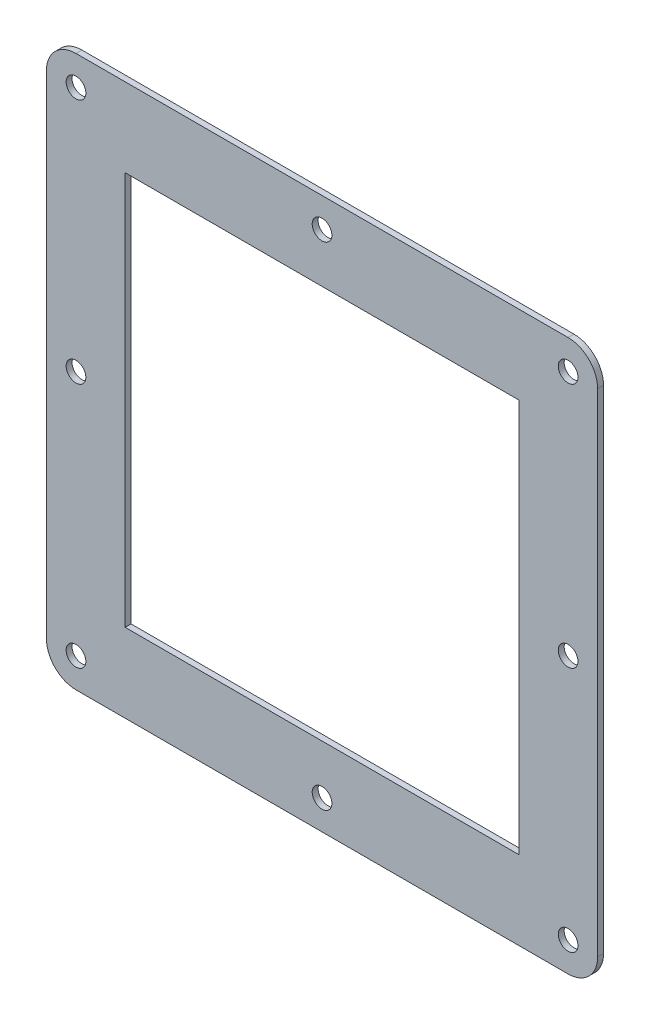
ISO-10303-21;
HEADER;
FILE_DESCRIPTION(('STEP AP214'),'2;1');
FILE_NAME('part.step','',(''),(''),'','','');
FILE_SCHEMA(('AUTOMOTIVE_DESIGN { 1 0 10303 214 1 1 1 1 }'));
ENDSEC;
DATA;
#1=APPLICATION_CONTEXT('core data for automotive mechanical design processes');
#2=APPLICATION_PROTOCOL_DEFINITION('international standard','automotive_design',2000,#1);
#3=PRODUCT_CONTEXT('',#1,'mechanical');
#4=PRODUCT('Part','Part','',(#3));
#5=PRODUCT_RELATED_PRODUCT_CATEGORY('part','',(#4));
#6=PRODUCT_DEFINITION_FORMATION('','',#4);
#7=PRODUCT_DEFINITION_CONTEXT('part definition',#1,'design');
#8=PRODUCT_DEFINITION('design','',#6,#7);
#9=PRODUCT_DEFINITION_SHAPE('','',#8);
#10=(LENGTH_UNIT() NAMED_UNIT(*) SI_UNIT(.MILLI.,.METRE.));
#11=(NAMED_UNIT(*) PLANE_ANGLE_UNIT() SI_UNIT($,.RADIAN.));
#12=(NAMED_UNIT(*) SI_UNIT($,.STERADIAN.) SOLID_ANGLE_UNIT());
#13=UNCERTAINTY_MEASURE_WITH_UNIT(LENGTH_MEASURE(1.E-05),#10,'distance_accuracy_value','');
#14=(GEOMETRIC_REPRESENTATION_CONTEXT(3) GLOBAL_UNCERTAINTY_ASSIGNED_CONTEXT((#13)) GLOBAL_UNIT_ASSIGNED_CONTEXT((#10,
#11,#12)) REPRESENTATION_CONTEXT('',''));
#15=CARTESIAN_POINT('',(0.,0.,0.));
#16=DIRECTION('',(0.,0.,1.));
#17=DIRECTION('',(1.,0.,0.));
#18=AXIS2_PLACEMENT_3D('',#15,#16,#17);
#19=CARTESIAN_POINT('',(-125.,-125.,3.));
#20=DIRECTION('',(0.,0.,1.));
#21=DIRECTION('',(1.,0.,0.));
#22=AXIS2_PLACEMENT_3D('',#19,#20,#21);
#23=PLANE('',#22);
#24=DIRECTION('',(0.,1.,0.));
#25=VECTOR('',#24,1.);
#26=CARTESIAN_POINT('',(100.,100.,3.));
#27=LINE('',#26,#25);
#28=CARTESIAN_POINT('',(100.,-100.,3.));
#29=VERTEX_POINT('',#28);
#30=CARTESIAN_POINT('',(100.,100.,3.));
#31=VERTEX_POINT('',#30);
#32=EDGE_CURVE('E48',#29,#31,#27,.T.);
#33=ORIENTED_EDGE('',*,*,#32,.F.);
#34=DIRECTION('',(1.,0.,0.));
#35=VECTOR('',#34,1.);
#36=CARTESIAN_POINT('',(-100.,-100.,3.));
#37=LINE('',#36,#35);
#38=CARTESIAN_POINT('',(-100.,-100.,3.));
#39=VERTEX_POINT('',#38);
#40=EDGE_CURVE('E140',#39,#29,#37,.T.);
#41=ORIENTED_EDGE('',*,*,#40,.F.);
#42=DIRECTION('',(0.,-1.,0.));
#43=VECTOR('',#42,1.);
#44=CARTESIAN_POINT('',(-100.,100.,3.));
#45=LINE('',#44,#43);
#46=CARTESIAN_POINT('',(-100.,100.,3.));
#47=VERTEX_POINT('',#46);
#48=EDGE_CURVE('E125',#47,#39,#45,.T.);
#49=ORIENTED_EDGE('',*,*,#48,.F.);
#50=DIRECTION('',(-1.,0.,0.));
#51=VECTOR('',#50,1.);
#52=CARTESIAN_POINT('',(-100.,100.,3.));
#53=LINE('',#52,#51);
#54=EDGE_CURVE('E134',#31,#47,#53,.T.);
#55=ORIENTED_EDGE('',*,*,#54,.F.);
#56=EDGE_LOOP('',(#33,#41,#49,#55));
#57=FACE_BOUND('',#56,.T.);
#58=CARTESIAN_POINT('',(0.,-125.,3.));
#59=DIRECTION('',(0.,0.,1.));
#60=DIRECTION('',(1.,0.,0.));
#61=AXIS2_PLACEMENT_3D('',#58,#59,#60);
#62=CIRCLE('',#61,5.);
#63=CARTESIAN_POINT('',(5.,-125.,3.));
#64=VERTEX_POINT('',#63);
#65=EDGE_CURVE('E156',#64,#64,#62,.T.);
#66=ORIENTED_EDGE('',*,*,#65,.F.);
#67=EDGE_LOOP('',(#66));
#68=FACE_BOUND('',#67,.T.);
#69=CARTESIAN_POINT('',(125.,0.,3.));
#70=DIRECTION('',(0.,0.,1.));
#71=DIRECTION('',(1.,0.,0.));
#72=AXIS2_PLACEMENT_3D('',#69,#70,#71);
#73=CIRCLE('',#72,5.00000000000001);
#74=CARTESIAN_POINT('',(130.,0.,3.));
#75=VERTEX_POINT('',#74);
#76=EDGE_CURVE('E174',#75,#75,#73,.T.);
#77=ORIENTED_EDGE('',*,*,#76,.F.);
#78=EDGE_LOOP('',(#77));
#79=FACE_BOUND('',#78,.T.);
#80=CARTESIAN_POINT('',(0.,125.,3.));
#81=DIRECTION('',(0.,0.,1.));
#82=DIRECTION('',(1.,0.,0.));
#83=AXIS2_PLACEMENT_3D('',#80,#81,#82);
#84=CIRCLE('',#83,5.);
#85=CARTESIAN_POINT('',(4.99999999999999,125.,3.));
#86=VERTEX_POINT('',#85);
#87=EDGE_CURVE('E186',#86,#86,#84,.T.);
#88=ORIENTED_EDGE('',*,*,#87,.F.);
#89=EDGE_LOOP('',(#88));
#90=FACE_BOUND('',#89,.T.);
#91=CARTESIAN_POINT('',(-125.,-125.,3.));
#92=DIRECTION('',(0.,0.,1.));
#93=DIRECTION('',(1.,0.,0.));
#94=AXIS2_PLACEMENT_3D('',#91,#92,#93);
#95=CIRCLE('',#94,15.);
#96=CARTESIAN_POINT('',(-140.,-125.,3.));
#97=VERTEX_POINT('',#96);
#98=CARTESIAN_POINT('',(-125.,-140.,3.));
#99=VERTEX_POINT('',#98);
#100=EDGE_CURVE('E198',#97,#99,#95,.T.);
#101=ORIENTED_EDGE('',*,*,#100,.T.);
#102=DIRECTION('',(1.,0.,0.));
#103=VECTOR('',#102,1.);
#104=CARTESIAN_POINT('',(-125.,-140.,3.));
#105=LINE('',#104,#103);
#106=CARTESIAN_POINT('',(125.,-140.,3.));
#107=VERTEX_POINT('',#106);
#108=EDGE_CURVE('E201',#99,#107,#105,.T.);
#109=ORIENTED_EDGE('',*,*,#108,.T.);
#110=CARTESIAN_POINT('',(125.,-125.,3.));
#111=DIRECTION('',(0.,0.,1.));
#112=DIRECTION('',(1.,0.,0.));
#113=AXIS2_PLACEMENT_3D('',#110,#111,#112);
#114=CIRCLE('',#113,15.);
#115=CARTESIAN_POINT('',(140.,-125.,3.));
#116=VERTEX_POINT('',#115);
#117=EDGE_CURVE('E204',#107,#116,#114,.T.);
#118=ORIENTED_EDGE('',*,*,#117,.T.);
#119=DIRECTION('',(0.,1.,0.));
#120=VECTOR('',#119,1.);
#121=CARTESIAN_POINT('',(140.,125.,3.));
#122=LINE('',#121,#120);
#123=CARTESIAN_POINT('',(140.,125.,3.));
#124=VERTEX_POINT('',#123);
#125=EDGE_CURVE('E206',#116,#124,#122,.T.);
#126=ORIENTED_EDGE('',*,*,#125,.T.);
#127=CARTESIAN_POINT('',(125.,125.,3.));
#128=DIRECTION('',(0.,0.,1.));
#129=DIRECTION('',(-1.,0.,0.));
#130=AXIS2_PLACEMENT_3D('',#127,#128,#129);
#131=CIRCLE('',#130,15.);
#132=CARTESIAN_POINT('',(125.,140.,3.));
#133=VERTEX_POINT('',#132);
#134=EDGE_CURVE('E208',#124,#133,#131,.T.);
#135=ORIENTED_EDGE('',*,*,#134,.T.);
#136=DIRECTION('',(-1.,0.,0.));
#137=VECTOR('',#136,1.);
#138=CARTESIAN_POINT('',(-125.,140.,3.));
#139=LINE('',#138,#137);
#140=CARTESIAN_POINT('',(-125.,140.,3.));
#141=VERTEX_POINT('',#140);
#142=EDGE_CURVE('E210',#133,#141,#139,.T.);
#143=ORIENTED_EDGE('',*,*,#142,.T.);
#144=CARTESIAN_POINT('',(-125.,125.,3.));
#145=DIRECTION('',(0.,0.,1.));
#146=DIRECTION('',(1.,0.,0.));
#147=AXIS2_PLACEMENT_3D('',#144,#145,#146);
#148=CIRCLE('',#147,15.);
#149=CARTESIAN_POINT('',(-140.,125.,3.));
#150=VERTEX_POINT('',#149);
#151=EDGE_CURVE('E212',#141,#150,#148,.T.);
#152=ORIENTED_EDGE('',*,*,#151,.T.);
#153=DIRECTION('',(0.,-1.,0.));
#154=VECTOR('',#153,1.);
#155=CARTESIAN_POINT('',(-140.,125.,3.));
#156=LINE('',#155,#154);
#157=EDGE_CURVE('E214',#150,#97,#156,.T.);
#158=ORIENTED_EDGE('',*,*,#157,.T.);
#159=EDGE_LOOP('',(#101,#109,#118,#126,#135,#143,#152,#158));
#160=FACE_BOUND('',#159,.T.);
#161=CARTESIAN_POINT('',(-125.,125.,3.));
#162=DIRECTION('',(0.,0.,1.));
#163=DIRECTION('',(1.,0.,0.));
#164=AXIS2_PLACEMENT_3D('',#161,#162,#163);
#165=CIRCLE('',#164,5.00000000000001);
#166=CARTESIAN_POINT('',(-120.,125.,3.));
#167=VERTEX_POINT('',#166);
#168=EDGE_CURVE('E192',#167,#167,#165,.T.);
#169=ORIENTED_EDGE('',*,*,#168,.F.);
#170=EDGE_LOOP('',(#169));
#171=FACE_BOUND('',#170,.T.);
#172=CARTESIAN_POINT('',(125.,125.,3.));
#173=DIRECTION('',(0.,0.,1.));
#174=DIRECTION('',(1.,0.,0.));
#175=AXIS2_PLACEMENT_3D('',#172,#173,#174);
#176=CIRCLE('',#175,4.99999999999999);
#177=CARTESIAN_POINT('',(130.,125.,3.));
#178=VERTEX_POINT('',#177);
#179=EDGE_CURVE('E180',#178,#178,#176,.T.);
#180=ORIENTED_EDGE('',*,*,#179,.F.);
#181=EDGE_LOOP('',(#180));
#182=FACE_BOUND('',#181,.T.);
#183=CARTESIAN_POINT('',(-125.,0.,3.));
#184=DIRECTION('',(0.,0.,1.));
#185=DIRECTION('',(1.,0.,0.));
#186=AXIS2_PLACEMENT_3D('',#183,#184,#185);
#187=CIRCLE('',#186,5.);
#188=CARTESIAN_POINT('',(-120.,0.,3.));
#189=VERTEX_POINT('',#188);
#190=EDGE_CURVE('E168',#189,#189,#187,.T.);
#191=ORIENTED_EDGE('',*,*,#190,.F.);
#192=EDGE_LOOP('',(#191));
#193=FACE_BOUND('',#192,.T.);
#194=CARTESIAN_POINT('',(-125.,-125.,3.));
#195=DIRECTION('',(0.,0.,1.));
#196=DIRECTION('',(1.,0.,0.));
#197=AXIS2_PLACEMENT_3D('',#194,#195,#196);
#198=CIRCLE('',#197,5.00000000000001);
#199=CARTESIAN_POINT('',(-120.,-125.,3.));
#200=VERTEX_POINT('',#199);
#201=EDGE_CURVE('E162',#200,#200,#198,.T.);
#202=ORIENTED_EDGE('',*,*,#201,.F.);
#203=EDGE_LOOP('',(#202));
#204=FACE_BOUND('',#203,.T.);
#205=CARTESIAN_POINT('',(125.,-125.,3.));
#206=DIRECTION('',(0.,0.,1.));
#207=DIRECTION('',(1.,0.,0.));
#208=AXIS2_PLACEMENT_3D('',#205,#206,#207);
#209=CIRCLE('',#208,5.00000000000002);
#210=CARTESIAN_POINT('',(130.,-125.,3.));
#211=VERTEX_POINT('',#210);
#212=EDGE_CURVE('E150',#211,#211,#209,.T.);
#213=ORIENTED_EDGE('',*,*,#212,.F.);
#214=EDGE_LOOP('',(#213));
#215=FACE_BOUND('',#214,.T.);
#216=ADVANCED_FACE('F33',(#57,#68,#79,#90,#160,#171,#182,#193,#204,#215),#23,.T.);
#217=CARTESIAN_POINT('',(-125.,-125.,0.));
#218=DIRECTION('',(0.,0.,1.));
#219=DIRECTION('',(1.,0.,0.));
#220=AXIS2_PLACEMENT_3D('',#217,#218,#219);
#221=PLANE('',#220);
#222=DIRECTION('',(1.,0.,0.));
#223=VECTOR('',#222,1.);
#224=CARTESIAN_POINT('',(-125.,-100.,0.));
#225=LINE('',#224,#223);
#226=CARTESIAN_POINT('',(-100.,-100.,0.));
#227=VERTEX_POINT('',#226);
#228=CARTESIAN_POINT('',(100.,-100.,0.));
#229=VERTEX_POINT('',#228);
#230=EDGE_CURVE('E41',#227,#229,#225,.T.);
#231=ORIENTED_EDGE('',*,*,#230,.T.);
#232=DIRECTION('',(0.,1.,0.));
#233=VECTOR('',#232,1.);
#234=CARTESIAN_POINT('',(100.,-125.,0.));
#235=LINE('',#234,#233);
#236=CARTESIAN_POINT('',(100.,100.,0.));
#237=VERTEX_POINT('',#236);
#238=EDGE_CURVE('E11',#229,#237,#235,.T.);
#239=ORIENTED_EDGE('',*,*,#238,.T.);
#240=DIRECTION('',(-1.,0.,0.));
#241=VECTOR('',#240,1.);
#242=CARTESIAN_POINT('',(-125.,100.,0.));
#243=LINE('',#242,#241);
#244=CARTESIAN_POINT('',(-100.,100.,0.));
#245=VERTEX_POINT('',#244);
#246=EDGE_CURVE('E255',#237,#245,#243,.T.);
#247=ORIENTED_EDGE('',*,*,#246,.T.);
#248=DIRECTION('',(0.,-1.,0.));
#249=VECTOR('',#248,1.);
#250=CARTESIAN_POINT('',(-100.,-125.,0.));
#251=LINE('',#250,#249);
#252=EDGE_CURVE('E128',#245,#227,#251,.T.);
#253=ORIENTED_EDGE('',*,*,#252,.T.);
#254=EDGE_LOOP('',(#231,#239,#247,#253));
#255=FACE_BOUND('',#254,.T.);
#256=CARTESIAN_POINT('',(-125.,-125.,0.));
#257=DIRECTION('',(0.,0.,1.));
#258=DIRECTION('',(1.,0.,0.));
#259=AXIS2_PLACEMENT_3D('',#256,#257,#258);
#260=CIRCLE('',#259,15.);
#261=CARTESIAN_POINT('',(-140.,-125.,0.));
#262=VERTEX_POINT('',#261);
#263=CARTESIAN_POINT('',(-125.,-140.,0.));
#264=VERTEX_POINT('',#263);
#265=EDGE_CURVE('E195',#262,#264,#260,.T.);
#266=ORIENTED_EDGE('',*,*,#265,.F.);
#267=DIRECTION('',(0.,-1.,0.));
#268=VECTOR('',#267,1.);
#269=CARTESIAN_POINT('',(-140.,125.,0.));
#270=LINE('',#269,#268);
#271=CARTESIAN_POINT('',(-140.,125.,0.));
#272=VERTEX_POINT('',#271);
#273=EDGE_CURVE('E202',#272,#262,#270,.T.);
#274=ORIENTED_EDGE('',*,*,#273,.F.);
#275=CARTESIAN_POINT('',(-125.,125.,0.));
#276=DIRECTION('',(0.,0.,1.));
#277=DIRECTION('',(1.,0.,0.));
#278=AXIS2_PLACEMENT_3D('',#275,#276,#277);
#279=CIRCLE('',#278,15.);
#280=CARTESIAN_POINT('',(-125.,140.,0.));
#281=VERTEX_POINT('',#280);
#282=EDGE_CURVE('E229',#281,#272,#279,.T.);
#283=ORIENTED_EDGE('',*,*,#282,.F.);
#284=DIRECTION('',(-1.,0.,0.));
#285=VECTOR('',#284,1.);
#286=CARTESIAN_POINT('',(-125.,140.,0.));
#287=LINE('',#286,#285);
#288=CARTESIAN_POINT('',(125.,140.,0.));
#289=VERTEX_POINT('',#288);
#290=EDGE_CURVE('E227',#289,#281,#287,.T.);
#291=ORIENTED_EDGE('',*,*,#290,.F.);
#292=CARTESIAN_POINT('',(125.,125.,0.));
#293=DIRECTION('',(0.,0.,1.));
#294=DIRECTION('',(-1.,0.,0.));
#295=AXIS2_PLACEMENT_3D('',#292,#293,#294);
#296=CIRCLE('',#295,15.);
#297=CARTESIAN_POINT('',(140.,125.,0.));
#298=VERTEX_POINT('',#297);
#299=EDGE_CURVE('E225',#298,#289,#296,.T.);
#300=ORIENTED_EDGE('',*,*,#299,.F.);
#301=DIRECTION('',(0.,1.,0.));
#302=VECTOR('',#301,1.);
#303=CARTESIAN_POINT('',(140.,125.,0.));
#304=LINE('',#303,#302);
#305=CARTESIAN_POINT('',(140.,-125.,0.));
#306=VERTEX_POINT('',#305);
#307=EDGE_CURVE('E223',#306,#298,#304,.T.);
#308=ORIENTED_EDGE('',*,*,#307,.F.);
#309=CARTESIAN_POINT('',(125.,-125.,0.));
#310=DIRECTION('',(0.,0.,1.));
#311=DIRECTION('',(1.,0.,0.));
#312=AXIS2_PLACEMENT_3D('',#309,#310,#311);
#313=CIRCLE('',#312,15.);
#314=CARTESIAN_POINT('',(125.,-140.,0.));
#315=VERTEX_POINT('',#314);
#316=EDGE_CURVE('E221',#315,#306,#313,.T.);
#317=ORIENTED_EDGE('',*,*,#316,.F.);
#318=DIRECTION('',(1.,0.,0.));
#319=VECTOR('',#318,1.);
#320=CARTESIAN_POINT('',(-125.,-140.,0.));
#321=LINE('',#320,#319);
#322=EDGE_CURVE('E219',#264,#315,#321,.T.);
#323=ORIENTED_EDGE('',*,*,#322,.F.);
#324=EDGE_LOOP('',(#266,#274,#283,#291,#300,#308,#317,#323));
#325=FACE_BOUND('',#324,.T.);
#326=CARTESIAN_POINT('',(-125.,125.,0.));
#327=DIRECTION('',(0.,0.,1.));
#328=DIRECTION('',(1.,0.,0.));
#329=AXIS2_PLACEMENT_3D('',#326,#327,#328);
#330=CIRCLE('',#329,5.00000000000001);
#331=CARTESIAN_POINT('',(-120.,125.,0.));
#332=VERTEX_POINT('',#331);
#333=EDGE_CURVE('E189',#332,#332,#330,.T.);
#334=ORIENTED_EDGE('',*,*,#333,.T.);
#335=EDGE_LOOP('',(#334));
#336=FACE_BOUND('',#335,.T.);
#337=CARTESIAN_POINT('',(0.,125.,0.));
#338=DIRECTION('',(0.,0.,1.));
#339=DIRECTION('',(1.,0.,0.));
#340=AXIS2_PLACEMENT_3D('',#337,#338,#339);
#341=CIRCLE('',#340,5.);
#342=CARTESIAN_POINT('',(4.99999999999999,125.,0.));
#343=VERTEX_POINT('',#342);
#344=EDGE_CURVE('E183',#343,#343,#341,.T.);
#345=ORIENTED_EDGE('',*,*,#344,.T.);
#346=EDGE_LOOP('',(#345));
#347=FACE_BOUND('',#346,.T.);
#348=CARTESIAN_POINT('',(125.,125.,0.));
#349=DIRECTION('',(0.,0.,1.));
#350=DIRECTION('',(1.,0.,0.));
#351=AXIS2_PLACEMENT_3D('',#348,#349,#350);
#352=CIRCLE('',#351,4.99999999999999);
#353=CARTESIAN_POINT('',(130.,125.,0.));
#354=VERTEX_POINT('',#353);
#355=EDGE_CURVE('E177',#354,#354,#352,.T.);
#356=ORIENTED_EDGE('',*,*,#355,.T.);
#357=EDGE_LOOP('',(#356));
#358=FACE_BOUND('',#357,.T.);
#359=CARTESIAN_POINT('',(125.,0.,0.));
#360=DIRECTION('',(0.,0.,1.));
#361=DIRECTION('',(1.,0.,0.));
#362=AXIS2_PLACEMENT_3D('',#359,#360,#361);
#363=CIRCLE('',#362,5.00000000000001);
#364=CARTESIAN_POINT('',(130.,0.,0.));
#365=VERTEX_POINT('',#364);
#366=EDGE_CURVE('E171',#365,#365,#363,.T.);
#367=ORIENTED_EDGE('',*,*,#366,.T.);
#368=EDGE_LOOP('',(#367));
#369=FACE_BOUND('',#368,.T.);
#370=CARTESIAN_POINT('',(-125.,0.,0.));
#371=DIRECTION('',(0.,0.,1.));
#372=DIRECTION('',(1.,0.,0.));
#373=AXIS2_PLACEMENT_3D('',#370,#371,#372);
#374=CIRCLE('',#373,5.);
#375=CARTESIAN_POINT('',(-120.,0.,0.));
#376=VERTEX_POINT('',#375);
#377=EDGE_CURVE('E165',#376,#376,#374,.T.);
#378=ORIENTED_EDGE('',*,*,#377,.T.);
#379=EDGE_LOOP('',(#378));
#380=FACE_BOUND('',#379,.T.);
#381=CARTESIAN_POINT('',(-125.,-125.,0.));
#382=DIRECTION('',(0.,0.,1.));
#383=DIRECTION('',(1.,0.,0.));
#384=AXIS2_PLACEMENT_3D('',#381,#382,#383);
#385=CIRCLE('',#384,5.00000000000001);
#386=CARTESIAN_POINT('',(-120.,-125.,0.));
#387=VERTEX_POINT('',#386);
#388=EDGE_CURVE('E159',#387,#387,#385,.T.);
#389=ORIENTED_EDGE('',*,*,#388,.T.);
#390=EDGE_LOOP('',(#389));
#391=FACE_BOUND('',#390,.T.);
#392=CARTESIAN_POINT('',(0.,-125.,0.));
#393=DIRECTION('',(0.,0.,1.));
#394=DIRECTION('',(1.,0.,0.));
#395=AXIS2_PLACEMENT_3D('',#392,#393,#394);
#396=CIRCLE('',#395,5.);
#397=CARTESIAN_POINT('',(5.,-125.,0.));
#398=VERTEX_POINT('',#397);
#399=EDGE_CURVE('E153',#398,#398,#396,.T.);
#400=ORIENTED_EDGE('',*,*,#399,.T.);
#401=EDGE_LOOP('',(#400));
#402=FACE_BOUND('',#401,.T.);
#403=CARTESIAN_POINT('',(125.,-125.,0.));
#404=DIRECTION('',(0.,0.,1.));
#405=DIRECTION('',(1.,0.,0.));
#406=AXIS2_PLACEMENT_3D('',#403,#404,#405);
#407=CIRCLE('',#406,5.00000000000002);
#408=CARTESIAN_POINT('',(130.,-125.,0.));
#409=VERTEX_POINT('',#408);
#410=EDGE_CURVE('E147',#409,#409,#407,.T.);
#411=ORIENTED_EDGE('',*,*,#410,.T.);
#412=EDGE_LOOP('',(#411));
#413=FACE_BOUND('',#412,.T.);
#414=ADVANCED_FACE('F259',(#255,#325,#336,#347,#358,#369,#380,#391,#402,#413),#221,.F.);
#415=CARTESIAN_POINT('',(-125.,-125.,3.));
#416=DIRECTION('',(0.,0.,-1.));
#417=DIRECTION('',(-1.,0.,0.));
#418=AXIS2_PLACEMENT_3D('',#415,#416,#417);
#419=CYLINDRICAL_SURFACE('',#418,15.);
#420=ORIENTED_EDGE('',*,*,#265,.T.);
#421=DIRECTION('',(0.,0.,-1.));
#422=VECTOR('',#421,1.);
#423=CARTESIAN_POINT('',(-125.,-140.,3.));
#424=LINE('',#423,#422);
#425=EDGE_CURVE('E252',#99,#264,#424,.T.);
#426=ORIENTED_EDGE('',*,*,#425,.F.);
#427=ORIENTED_EDGE('',*,*,#100,.F.);
#428=DIRECTION('',(0.,0.,-1.));
#429=VECTOR('',#428,1.);
#430=CARTESIAN_POINT('',(-140.,-125.,3.));
#431=LINE('',#430,#429);
#432=EDGE_CURVE('E216',#97,#262,#431,.T.);
#433=ORIENTED_EDGE('',*,*,#432,.T.);
#434=EDGE_LOOP('',(#420,#426,#427,#433));
#435=FACE_BOUND('',#434,.T.);
#436=ADVANCED_FACE('F35',(#435),#419,.T.);
#437=CARTESIAN_POINT('',(-125.,-140.,3.));
#438=DIRECTION('',(0.,1.,0.));
#439=DIRECTION('',(0.,0.,1.));
#440=AXIS2_PLACEMENT_3D('',#437,#438,#439);
#441=PLANE('',#440);
#442=ORIENTED_EDGE('',*,*,#322,.T.);
#443=DIRECTION('',(0.,0.,-1.));
#444=VECTOR('',#443,1.);
#445=CARTESIAN_POINT('',(125.,-140.,3.));
#446=LINE('',#445,#444);
#447=EDGE_CURVE('E249',#107,#315,#446,.T.);
#448=ORIENTED_EDGE('',*,*,#447,.F.);
#449=ORIENTED_EDGE('',*,*,#108,.F.);
#450=ORIENTED_EDGE('',*,*,#425,.T.);
#451=EDGE_LOOP('',(#442,#448,#449,#450));
#452=FACE_BOUND('',#451,.T.);
#453=ADVANCED_FACE('F309',(#452),#441,.F.);
#454=CARTESIAN_POINT('',(125.,-125.,3.));
#455=DIRECTION('',(0.,0.,-1.));
#456=DIRECTION('',(-1.,0.,0.));
#457=AXIS2_PLACEMENT_3D('',#454,#455,#456);
#458=CYLINDRICAL_SURFACE('',#457,15.);
#459=ORIENTED_EDGE('',*,*,#316,.T.);
#460=DIRECTION('',(0.,0.,-1.));
#461=VECTOR('',#460,1.);
#462=CARTESIAN_POINT('',(140.,-125.,3.));
#463=LINE('',#462,#461);
#464=EDGE_CURVE('E246',#116,#306,#463,.T.);
#465=ORIENTED_EDGE('',*,*,#464,.F.);
#466=ORIENTED_EDGE('',*,*,#117,.F.);
#467=ORIENTED_EDGE('',*,*,#447,.T.);
#468=EDGE_LOOP('',(#459,#465,#466,#467));
#469=FACE_BOUND('',#468,.T.);
#470=ADVANCED_FACE('F306',(#469),#458,.T.);
#471=CARTESIAN_POINT('',(140.,125.,3.));
#472=DIRECTION('',(-1.,0.,0.));
#473=DIRECTION('',(0.,0.,1.));
#474=AXIS2_PLACEMENT_3D('',#471,#472,#473);
#475=PLANE('',#474);
#476=ORIENTED_EDGE('',*,*,#307,.T.);
#477=DIRECTION('',(0.,0.,-1.));
#478=VECTOR('',#477,1.);
#479=CARTESIAN_POINT('',(140.,125.,3.));
#480=LINE('',#479,#478);
#481=EDGE_CURVE('E243',#124,#298,#480,.T.);
#482=ORIENTED_EDGE('',*,*,#481,.F.);
#483=ORIENTED_EDGE('',*,*,#125,.F.);
#484=ORIENTED_EDGE('',*,*,#464,.T.);
#485=EDGE_LOOP('',(#476,#482,#483,#484));
#486=FACE_BOUND('',#485,.T.);
#487=ADVANCED_FACE('F302',(#486),#475,.F.);
#488=CARTESIAN_POINT('',(125.,125.,3.));
#489=DIRECTION('',(0.,0.,-1.));
#490=DIRECTION('',(-1.,0.,0.));
#491=AXIS2_PLACEMENT_3D('',#488,#489,#490);
#492=CYLINDRICAL_SURFACE('',#491,15.);
#493=ORIENTED_EDGE('',*,*,#299,.T.);
#494=DIRECTION('',(0.,0.,-1.));
#495=VECTOR('',#494,1.);
#496=CARTESIAN_POINT('',(125.,140.,3.));
#497=LINE('',#496,#495);
#498=EDGE_CURVE('E240',#133,#289,#497,.T.);
#499=ORIENTED_EDGE('',*,*,#498,.F.);
#500=ORIENTED_EDGE('',*,*,#134,.F.);
#501=ORIENTED_EDGE('',*,*,#481,.T.);
#502=EDGE_LOOP('',(#493,#499,#500,#501));
#503=FACE_BOUND('',#502,.T.);
#504=ADVANCED_FACE('F298',(#503),#492,.T.);
#505=CARTESIAN_POINT('',(-125.,140.,3.));
#506=DIRECTION('',(0.,-1.,0.));
#507=DIRECTION('',(0.,0.,-1.));
#508=AXIS2_PLACEMENT_3D('',#505,#506,#507);
#509=PLANE('',#508);
#510=ORIENTED_EDGE('',*,*,#290,.T.);
#511=DIRECTION('',(0.,0.,-1.));
#512=VECTOR('',#511,1.);
#513=CARTESIAN_POINT('',(-125.,140.,3.));
#514=LINE('',#513,#512);
#515=EDGE_CURVE('E237',#141,#281,#514,.T.);
#516=ORIENTED_EDGE('',*,*,#515,.F.);
#517=ORIENTED_EDGE('',*,*,#142,.F.);
#518=ORIENTED_EDGE('',*,*,#498,.T.);
#519=EDGE_LOOP('',(#510,#516,#517,#518));
#520=FACE_BOUND('',#519,.T.);
#521=ADVANCED_FACE('F294',(#520),#509,.F.);
#522=CARTESIAN_POINT('',(-125.,125.,3.));
#523=DIRECTION('',(0.,0.,-1.));
#524=DIRECTION('',(-1.,0.,0.));
#525=AXIS2_PLACEMENT_3D('',#522,#523,#524);
#526=CYLINDRICAL_SURFACE('',#525,15.);
#527=ORIENTED_EDGE('',*,*,#282,.T.);
#528=DIRECTION('',(0.,0.,-1.));
#529=VECTOR('',#528,1.);
#530=CARTESIAN_POINT('',(-140.,125.,3.));
#531=LINE('',#530,#529);
#532=EDGE_CURVE('E234',#150,#272,#531,.T.);
#533=ORIENTED_EDGE('',*,*,#532,.F.);
#534=ORIENTED_EDGE('',*,*,#151,.F.);
#535=ORIENTED_EDGE('',*,*,#515,.T.);
#536=EDGE_LOOP('',(#527,#533,#534,#535));
#537=FACE_BOUND('',#536,.T.);
#538=ADVANCED_FACE('F290',(#537),#526,.T.);
#539=CARTESIAN_POINT('',(-140.,125.,3.));
#540=DIRECTION('',(1.,0.,0.));
#541=DIRECTION('',(0.,0.,-1.));
#542=AXIS2_PLACEMENT_3D('',#539,#540,#541);
#543=PLANE('',#542);
#544=ORIENTED_EDGE('',*,*,#273,.T.);
#545=ORIENTED_EDGE('',*,*,#432,.F.);
#546=ORIENTED_EDGE('',*,*,#157,.F.);
#547=ORIENTED_EDGE('',*,*,#532,.T.);
#548=EDGE_LOOP('',(#544,#545,#546,#547));
#549=FACE_BOUND('',#548,.T.);
#550=ADVANCED_FACE('F287',(#549),#543,.F.);
#551=CARTESIAN_POINT('',(-125.,125.,3.));
#552=DIRECTION('',(0.,0.,-1.));
#553=DIRECTION('',(-1.,0.,0.));
#554=AXIS2_PLACEMENT_3D('',#551,#552,#553);
#555=CYLINDRICAL_SURFACE('',#554,5.00000000000001);
#556=ORIENTED_EDGE('',*,*,#168,.T.);
#557=EDGE_LOOP('',(#556));
#558=FACE_BOUND('',#557,.T.);
#559=ORIENTED_EDGE('',*,*,#333,.F.);
#560=EDGE_LOOP('',(#559));
#561=FACE_BOUND('',#560,.T.);
#562=ADVANCED_FACE('F284',(#558,#561),#555,.F.);
#563=CARTESIAN_POINT('',(0.,125.,3.));
#564=DIRECTION('',(0.,0.,-1.));
#565=DIRECTION('',(-1.,0.,0.));
#566=AXIS2_PLACEMENT_3D('',#563,#564,#565);
#567=CYLINDRICAL_SURFACE('',#566,5.);
#568=ORIENTED_EDGE('',*,*,#87,.T.);
#569=EDGE_LOOP('',(#568));
#570=FACE_BOUND('',#569,.T.);
#571=ORIENTED_EDGE('',*,*,#344,.F.);
#572=EDGE_LOOP('',(#571));
#573=FACE_BOUND('',#572,.T.);
#574=ADVANCED_FACE('F380',(#570,#573),#567,.F.);
#575=CARTESIAN_POINT('',(125.,125.,3.));
#576=DIRECTION('',(0.,0.,-1.));
#577=DIRECTION('',(-1.,0.,0.));
#578=AXIS2_PLACEMENT_3D('',#575,#576,#577);
#579=CYLINDRICAL_SURFACE('',#578,4.99999999999999);
#580=ORIENTED_EDGE('',*,*,#179,.T.);
#581=EDGE_LOOP('',(#580));
#582=FACE_BOUND('',#581,.T.);
#583=ORIENTED_EDGE('',*,*,#355,.F.);
#584=EDGE_LOOP('',(#583));
#585=FACE_BOUND('',#584,.T.);
#586=ADVANCED_FACE('F377',(#582,#585),#579,.F.);
#587=CARTESIAN_POINT('',(125.,0.,3.));
#588=DIRECTION('',(0.,0.,-1.));
#589=DIRECTION('',(-1.,0.,0.));
#590=AXIS2_PLACEMENT_3D('',#587,#588,#589);
#591=CYLINDRICAL_SURFACE('',#590,5.00000000000001);
#592=ORIENTED_EDGE('',*,*,#76,.T.);
#593=EDGE_LOOP('',(#592));
#594=FACE_BOUND('',#593,.T.);
#595=ORIENTED_EDGE('',*,*,#366,.F.);
#596=EDGE_LOOP('',(#595));
#597=FACE_BOUND('',#596,.T.);
#598=ADVANCED_FACE('F373',(#594,#597),#591,.F.);
#599=CARTESIAN_POINT('',(-125.,0.,3.));
#600=DIRECTION('',(0.,0.,-1.));
#601=DIRECTION('',(-1.,0.,0.));
#602=AXIS2_PLACEMENT_3D('',#599,#600,#601);
#603=CYLINDRICAL_SURFACE('',#602,5.);
#604=ORIENTED_EDGE('',*,*,#190,.T.);
#605=EDGE_LOOP('',(#604));
#606=FACE_BOUND('',#605,.T.);
#607=ORIENTED_EDGE('',*,*,#377,.F.);
#608=EDGE_LOOP('',(#607));
#609=FACE_BOUND('',#608,.T.);
#610=ADVANCED_FACE('F358',(#606,#609),#603,.F.);
#611=CARTESIAN_POINT('',(-125.,-125.,3.));
#612=DIRECTION('',(0.,0.,-1.));
#613=DIRECTION('',(-1.,0.,0.));
#614=AXIS2_PLACEMENT_3D('',#611,#612,#613);
#615=CYLINDRICAL_SURFACE('',#614,5.00000000000001);
#616=ORIENTED_EDGE('',*,*,#201,.T.);
#617=EDGE_LOOP('',(#616));
#618=FACE_BOUND('',#617,.T.);
#619=ORIENTED_EDGE('',*,*,#388,.F.);
#620=EDGE_LOOP('',(#619));
#621=FACE_BOUND('',#620,.T.);
#622=ADVANCED_FACE('F355',(#618,#621),#615,.F.);
#623=CARTESIAN_POINT('',(0.,-125.,3.));
#624=DIRECTION('',(0.,0.,-1.));
#625=DIRECTION('',(-1.,0.,0.));
#626=AXIS2_PLACEMENT_3D('',#623,#624,#625);
#627=CYLINDRICAL_SURFACE('',#626,5.);
#628=ORIENTED_EDGE('',*,*,#65,.T.);
#629=EDGE_LOOP('',(#628));
#630=FACE_BOUND('',#629,.T.);
#631=ORIENTED_EDGE('',*,*,#399,.F.);
#632=EDGE_LOOP('',(#631));
#633=FACE_BOUND('',#632,.T.);
#634=ADVANCED_FACE('F273',(#630,#633),#627,.F.);
#635=CARTESIAN_POINT('',(125.,-125.,3.));
#636=DIRECTION('',(0.,0.,-1.));
#637=DIRECTION('',(-1.,0.,0.));
#638=AXIS2_PLACEMENT_3D('',#635,#636,#637);
#639=CYLINDRICAL_SURFACE('',#638,5.00000000000002);
#640=ORIENTED_EDGE('',*,*,#212,.T.);
#641=EDGE_LOOP('',(#640));
#642=FACE_BOUND('',#641,.T.);
#643=ORIENTED_EDGE('',*,*,#410,.F.);
#644=EDGE_LOOP('',(#643));
#645=FACE_BOUND('',#644,.T.);
#646=ADVANCED_FACE('F266',(#642,#645),#639,.F.);
#647=CARTESIAN_POINT('',(100.,100.,-7.));
#648=DIRECTION('',(1.,0.,0.));
#649=DIRECTION('',(0.,1.,0.));
#650=AXIS2_PLACEMENT_3D('',#647,#648,#649);
#651=PLANE('',#650);
#652=DIRECTION('',(0.,0.,1.));
#653=VECTOR('',#652,1.);
#654=CARTESIAN_POINT('',(100.,-100.,-7.));
#655=LINE('',#654,#653);
#656=EDGE_CURVE('E145',#229,#29,#655,.T.);
#657=ORIENTED_EDGE('',*,*,#656,.T.);
#658=ORIENTED_EDGE('',*,*,#32,.T.);
#659=DIRECTION('',(0.,0.,1.));
#660=VECTOR('',#659,1.);
#661=CARTESIAN_POINT('',(100.,100.,-7.));
#662=LINE('',#661,#660);
#663=EDGE_CURVE('E131',#237,#31,#662,.T.);
#664=ORIENTED_EDGE('',*,*,#663,.F.);
#665=ORIENTED_EDGE('',*,*,#238,.F.);
#666=EDGE_LOOP('',(#657,#658,#664,#665));
#667=FACE_BOUND('',#666,.T.);
#668=ADVANCED_FACE('F264',(#667),#651,.F.);
#669=CARTESIAN_POINT('',(-100.,-100.,-7.));
#670=DIRECTION('',(0.,-1.,0.));
#671=DIRECTION('',(0.,0.,-1.));
#672=AXIS2_PLACEMENT_3D('',#669,#670,#671);
#673=PLANE('',#672);
#674=DIRECTION('',(0.,0.,1.));
#675=VECTOR('',#674,1.);
#676=CARTESIAN_POINT('',(-100.,-100.,-7.));
#677=LINE('',#676,#675);
#678=EDGE_CURVE('E130',#227,#39,#677,.T.);
#679=ORIENTED_EDGE('',*,*,#678,.T.);
#680=ORIENTED_EDGE('',*,*,#40,.T.);
#681=ORIENTED_EDGE('',*,*,#656,.F.);
#682=ORIENTED_EDGE('',*,*,#230,.F.);
#683=EDGE_LOOP('',(#679,#680,#681,#682));
#684=FACE_BOUND('',#683,.T.);
#685=ADVANCED_FACE('F263',(#684),#673,.F.);
#686=CARTESIAN_POINT('',(-100.,100.,-7.));
#687=DIRECTION('',(-1.,0.,0.));
#688=DIRECTION('',(0.,-1.,0.));
#689=AXIS2_PLACEMENT_3D('',#686,#687,#688);
#690=PLANE('',#689);
#691=DIRECTION('',(0.,0.,1.));
#692=VECTOR('',#691,1.);
#693=CARTESIAN_POINT('',(-100.,100.,-7.));
#694=LINE('',#693,#692);
#695=EDGE_CURVE('E56',#245,#47,#694,.T.);
#696=ORIENTED_EDGE('',*,*,#695,.T.);
#697=ORIENTED_EDGE('',*,*,#48,.T.);
#698=ORIENTED_EDGE('',*,*,#678,.F.);
#699=ORIENTED_EDGE('',*,*,#252,.F.);
#700=EDGE_LOOP('',(#696,#697,#698,#699));
#701=FACE_BOUND('',#700,.T.);
#702=ADVANCED_FACE('F122',(#701),#690,.F.);
#703=CARTESIAN_POINT('',(-100.,100.,-7.));
#704=DIRECTION('',(0.,1.,0.));
#705=DIRECTION('',(0.,0.,1.));
#706=AXIS2_PLACEMENT_3D('',#703,#704,#705);
#707=PLANE('',#706);
#708=ORIENTED_EDGE('',*,*,#663,.T.);
#709=ORIENTED_EDGE('',*,*,#54,.T.);
#710=ORIENTED_EDGE('',*,*,#695,.F.);
#711=ORIENTED_EDGE('',*,*,#246,.F.);
#712=EDGE_LOOP('',(#708,#709,#710,#711));
#713=FACE_BOUND('',#712,.T.);
#714=ADVANCED_FACE('F135',(#713),#707,.F.);
#715=CLOSED_SHELL('',(#216,#414,#436,#453,#470,#487,#504,#521,#538,#550,#562,#574,#586,#598,
#610,#622,#634,#646,#668,#685,#702,#714));
#716=MANIFOLD_SOLID_BREP('B2',#715);
#717=ADVANCED_BREP_SHAPE_REPRESENTATION('',(#18,#716),#14);
#718=SHAPE_DEFINITION_REPRESENTATION(#9,#717);
ENDSEC;
END-ISO-10303-21;
